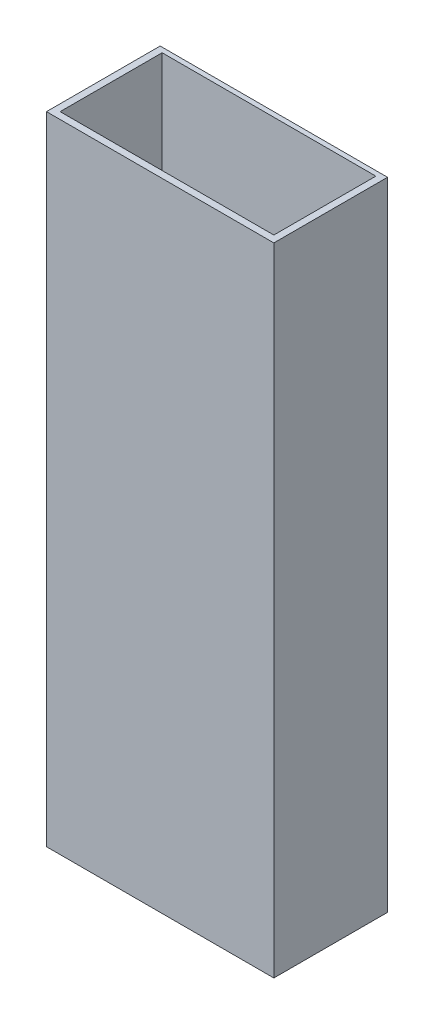
ISO-10303-21;
HEADER;
FILE_DESCRIPTION(('STEP AP214'),'2;1');
FILE_NAME('part.step','',(''),(''),'','','');
FILE_SCHEMA(('AUTOMOTIVE_DESIGN { 1 0 10303 214 1 1 1 1 }'));
ENDSEC;
DATA;
#1=APPLICATION_CONTEXT('core data for automotive mechanical design processes');
#2=APPLICATION_PROTOCOL_DEFINITION('international standard','automotive_design',2000,#1);
#3=PRODUCT_CONTEXT('',#1,'mechanical');
#4=PRODUCT('Part','Part','',(#3));
#5=PRODUCT_RELATED_PRODUCT_CATEGORY('part','',(#4));
#6=PRODUCT_DEFINITION_FORMATION('','',#4);
#7=PRODUCT_DEFINITION_CONTEXT('part definition',#1,'design');
#8=PRODUCT_DEFINITION('design','',#6,#7);
#9=PRODUCT_DEFINITION_SHAPE('','',#8);
#10=(LENGTH_UNIT() NAMED_UNIT(*) SI_UNIT(.MILLI.,.METRE.));
#11=(NAMED_UNIT(*) PLANE_ANGLE_UNIT() SI_UNIT($,.RADIAN.));
#12=(NAMED_UNIT(*) SI_UNIT($,.STERADIAN.) SOLID_ANGLE_UNIT());
#13=UNCERTAINTY_MEASURE_WITH_UNIT(LENGTH_MEASURE(1.E-05),#10,'distance_accuracy_value','');
#14=(GEOMETRIC_REPRESENTATION_CONTEXT(3) GLOBAL_UNCERTAINTY_ASSIGNED_CONTEXT((#13)) GLOBAL_UNIT_ASSIGNED_CONTEXT((#10,
#11,#12)) REPRESENTATION_CONTEXT('',''));
#15=CARTESIAN_POINT('',(0.,0.,0.));
#16=DIRECTION('',(0.,0.,1.));
#17=DIRECTION('',(1.,0.,0.));
#18=AXIS2_PLACEMENT_3D('',#15,#16,#17);
#19=CARTESIAN_POINT('',(0.,140.,0.));
#20=DIRECTION('',(0.,-1.,0.));
#21=DIRECTION('',(0.,0.,-1.));
#22=AXIS2_PLACEMENT_3D('',#19,#20,#21);
#23=PLANE('',#22);
#24=DIRECTION('',(0.,0.,1.));
#25=VECTOR('',#24,1.);
#26=CARTESIAN_POINT('',(0.,140.,0.));
#27=LINE('',#26,#25);
#28=CARTESIAN_POINT('',(0.,140.,-25.));
#29=VERTEX_POINT('',#28);
#30=CARTESIAN_POINT('',(0.,140.,0.));
#31=VERTEX_POINT('',#30);
#32=EDGE_CURVE('E134',#29,#31,#27,.T.);
#33=ORIENTED_EDGE('',*,*,#32,.T.);
#34=DIRECTION('',(1.,0.,0.));
#35=VECTOR('',#34,1.);
#36=CARTESIAN_POINT('',(0.,140.,0.));
#37=LINE('',#36,#35);
#38=CARTESIAN_POINT('',(50.,140.,0.));
#39=VERTEX_POINT('',#38);
#40=EDGE_CURVE('E137',#31,#39,#37,.T.);
#41=ORIENTED_EDGE('',*,*,#40,.T.);
#42=DIRECTION('',(0.,0.,-1.));
#43=VECTOR('',#42,1.);
#44=CARTESIAN_POINT('',(50.,140.,0.));
#45=LINE('',#44,#43);
#46=CARTESIAN_POINT('',(50.,140.,-25.));
#47=VERTEX_POINT('',#46);
#48=EDGE_CURVE('E140',#39,#47,#45,.T.);
#49=ORIENTED_EDGE('',*,*,#48,.T.);
#50=DIRECTION('',(-1.,0.,0.));
#51=VECTOR('',#50,1.);
#52=CARTESIAN_POINT('',(0.,140.,-25.));
#53=LINE('',#52,#51);
#54=EDGE_CURVE('E142',#47,#29,#53,.T.);
#55=ORIENTED_EDGE('',*,*,#54,.T.);
#56=EDGE_LOOP('',(#33,#41,#49,#55));
#57=FACE_BOUND('',#56,.T.);
#58=DIRECTION('',(0.,0.,1.));
#59=VECTOR('',#58,1.);
#60=CARTESIAN_POINT('',(1.49999999999999,140.,-1.49999999999999));
#61=LINE('',#60,#59);
#62=CARTESIAN_POINT('',(1.49999999999999,140.,-23.9343870252012));
#63=VERTEX_POINT('',#62);
#64=CARTESIAN_POINT('',(1.49999999999999,140.,-1.49999999999999));
#65=VERTEX_POINT('',#64);
#66=EDGE_CURVE('E98',#63,#65,#61,.T.);
#67=ORIENTED_EDGE('',*,*,#66,.F.);
#68=DIRECTION('',(-1.,0.,0.));
#69=VECTOR('',#68,1.);
#70=CARTESIAN_POINT('',(48.5,140.,-23.9343870252012));
#71=LINE('',#70,#69);
#72=CARTESIAN_POINT('',(48.5,140.,-23.9343870252012));
#73=VERTEX_POINT('',#72);
#74=EDGE_CURVE('E120',#73,#63,#71,.T.);
#75=ORIENTED_EDGE('',*,*,#74,.F.);
#76=DIRECTION('',(0.,0.,-1.));
#77=VECTOR('',#76,1.);
#78=CARTESIAN_POINT('',(48.5,140.,-1.49999999999999));
#79=LINE('',#78,#77);
#80=CARTESIAN_POINT('',(48.5,140.,-1.49999999999999));
#81=VERTEX_POINT('',#80);
#82=EDGE_CURVE('E118',#81,#73,#79,.T.);
#83=ORIENTED_EDGE('',*,*,#82,.F.);
#84=DIRECTION('',(1.,0.,0.));
#85=VECTOR('',#84,1.);
#86=CARTESIAN_POINT('',(48.5,140.,-1.49999999999999));
#87=LINE('',#86,#85);
#88=EDGE_CURVE('E106',#65,#81,#87,.T.);
#89=ORIENTED_EDGE('',*,*,#88,.F.);
#90=EDGE_LOOP('',(#67,#75,#83,#89));
#91=FACE_BOUND('',#90,.T.);
#92=ADVANCED_FACE('F33',(#57,#91),#23,.F.);
#93=CARTESIAN_POINT('',(0.,0.,0.));
#94=DIRECTION('',(0.,-1.,0.));
#95=DIRECTION('',(0.,0.,-1.));
#96=AXIS2_PLACEMENT_3D('',#93,#94,#95);
#97=PLANE('',#96);
#98=DIRECTION('',(0.,0.,1.));
#99=VECTOR('',#98,1.);
#100=CARTESIAN_POINT('',(0.,0.,0.));
#101=LINE('',#100,#99);
#102=CARTESIAN_POINT('',(0.,0.,-25.));
#103=VERTEX_POINT('',#102);
#104=CARTESIAN_POINT('',(0.,0.,0.));
#105=VERTEX_POINT('',#104);
#106=EDGE_CURVE('E114',#103,#105,#101,.T.);
#107=ORIENTED_EDGE('',*,*,#106,.F.);
#108=DIRECTION('',(-1.,0.,0.));
#109=VECTOR('',#108,1.);
#110=CARTESIAN_POINT('',(0.,0.,-25.));
#111=LINE('',#110,#109);
#112=CARTESIAN_POINT('',(50.,0.,-25.));
#113=VERTEX_POINT('',#112);
#114=EDGE_CURVE('E138',#113,#103,#111,.T.);
#115=ORIENTED_EDGE('',*,*,#114,.F.);
#116=DIRECTION('',(0.,0.,-1.));
#117=VECTOR('',#116,1.);
#118=CARTESIAN_POINT('',(50.,0.,0.));
#119=LINE('',#118,#117);
#120=CARTESIAN_POINT('',(50.,0.,0.));
#121=VERTEX_POINT('',#120);
#122=EDGE_CURVE('E149',#121,#113,#119,.T.);
#123=ORIENTED_EDGE('',*,*,#122,.F.);
#124=DIRECTION('',(1.,0.,0.));
#125=VECTOR('',#124,1.);
#126=CARTESIAN_POINT('',(0.,0.,0.));
#127=LINE('',#126,#125);
#128=EDGE_CURVE('E147',#105,#121,#127,.T.);
#129=ORIENTED_EDGE('',*,*,#128,.F.);
#130=EDGE_LOOP('',(#107,#115,#123,#129));
#131=FACE_BOUND('',#130,.T.);
#132=DIRECTION('',(-1.,0.,0.));
#133=VECTOR('',#132,1.);
#134=CARTESIAN_POINT('',(48.5,0.,-23.9343870252012));
#135=LINE('',#134,#133);
#136=CARTESIAN_POINT('',(48.5,0.,-23.9343870252012));
#137=VERTEX_POINT('',#136);
#138=CARTESIAN_POINT('',(1.49999999999999,0.,-23.9343870252012));
#139=VERTEX_POINT('',#138);
#140=EDGE_CURVE('E107',#137,#139,#135,.T.);
#141=ORIENTED_EDGE('',*,*,#140,.T.);
#142=DIRECTION('',(0.,0.,1.));
#143=VECTOR('',#142,1.);
#144=CARTESIAN_POINT('',(1.49999999999999,0.,-1.49999999999999));
#145=LINE('',#144,#143);
#146=CARTESIAN_POINT('',(1.49999999999999,0.,-1.49999999999999));
#147=VERTEX_POINT('',#146);
#148=EDGE_CURVE('E56',#139,#147,#145,.T.);
#149=ORIENTED_EDGE('',*,*,#148,.T.);
#150=DIRECTION('',(1.,0.,0.));
#151=VECTOR('',#150,1.);
#152=CARTESIAN_POINT('',(48.5,0.,-1.49999999999999));
#153=LINE('',#152,#151);
#154=CARTESIAN_POINT('',(48.5,0.,-1.49999999999999));
#155=VERTEX_POINT('',#154);
#156=EDGE_CURVE('E113',#147,#155,#153,.T.);
#157=ORIENTED_EDGE('',*,*,#156,.T.);
#158=DIRECTION('',(0.,0.,-1.));
#159=VECTOR('',#158,1.);
#160=CARTESIAN_POINT('',(48.5,0.,-1.49999999999999));
#161=LINE('',#160,#159);
#162=EDGE_CURVE('E126',#155,#137,#161,.T.);
#163=ORIENTED_EDGE('',*,*,#162,.T.);
#164=EDGE_LOOP('',(#141,#149,#157,#163));
#165=FACE_BOUND('',#164,.T.);
#166=ADVANCED_FACE('F167',(#131,#165),#97,.T.);
#167=CARTESIAN_POINT('',(0.,140.,0.));
#168=DIRECTION('',(1.,0.,0.));
#169=DIRECTION('',(0.,0.,-1.));
#170=AXIS2_PLACEMENT_3D('',#167,#168,#169);
#171=PLANE('',#170);
#172=ORIENTED_EDGE('',*,*,#106,.T.);
#173=DIRECTION('',(0.,-1.,0.));
#174=VECTOR('',#173,1.);
#175=CARTESIAN_POINT('',(0.,140.,0.));
#176=LINE('',#175,#174);
#177=EDGE_CURVE('E11',#31,#105,#176,.T.);
#178=ORIENTED_EDGE('',*,*,#177,.F.);
#179=ORIENTED_EDGE('',*,*,#32,.F.);
#180=DIRECTION('',(0.,-1.,0.));
#181=VECTOR('',#180,1.);
#182=CARTESIAN_POINT('',(0.,140.,-25.));
#183=LINE('',#182,#181);
#184=EDGE_CURVE('E144',#29,#103,#183,.T.);
#185=ORIENTED_EDGE('',*,*,#184,.T.);
#186=EDGE_LOOP('',(#172,#178,#179,#185));
#187=FACE_BOUND('',#186,.T.);
#188=ADVANCED_FACE('F35',(#187),#171,.F.);
#189=CARTESIAN_POINT('',(0.,140.,0.));
#190=DIRECTION('',(0.,0.,-1.));
#191=DIRECTION('',(-1.,0.,0.));
#192=AXIS2_PLACEMENT_3D('',#189,#190,#191);
#193=PLANE('',#192);
#194=ORIENTED_EDGE('',*,*,#128,.T.);
#195=DIRECTION('',(0.,-1.,0.));
#196=VECTOR('',#195,1.);
#197=CARTESIAN_POINT('',(50.,140.,0.));
#198=LINE('',#197,#196);
#199=EDGE_CURVE('E41',#39,#121,#198,.T.);
#200=ORIENTED_EDGE('',*,*,#199,.F.);
#201=ORIENTED_EDGE('',*,*,#40,.F.);
#202=ORIENTED_EDGE('',*,*,#177,.T.);
#203=EDGE_LOOP('',(#194,#200,#201,#202));
#204=FACE_BOUND('',#203,.T.);
#205=ADVANCED_FACE('F177',(#204),#193,.F.);
#206=CARTESIAN_POINT('',(50.,140.,0.));
#207=DIRECTION('',(-1.,0.,0.));
#208=DIRECTION('',(0.,0.,1.));
#209=AXIS2_PLACEMENT_3D('',#206,#207,#208);
#210=PLANE('',#209);
#211=ORIENTED_EDGE('',*,*,#122,.T.);
#212=DIRECTION('',(0.,-1.,0.));
#213=VECTOR('',#212,1.);
#214=CARTESIAN_POINT('',(50.,140.,-25.));
#215=LINE('',#214,#213);
#216=EDGE_CURVE('E154',#47,#113,#215,.T.);
#217=ORIENTED_EDGE('',*,*,#216,.F.);
#218=ORIENTED_EDGE('',*,*,#48,.F.);
#219=ORIENTED_EDGE('',*,*,#199,.T.);
#220=EDGE_LOOP('',(#211,#217,#218,#219));
#221=FACE_BOUND('',#220,.T.);
#222=ADVANCED_FACE('F161',(#221),#210,.F.);
#223=CARTESIAN_POINT('',(0.,140.,-25.));
#224=DIRECTION('',(0.,0.,1.));
#225=DIRECTION('',(1.,0.,0.));
#226=AXIS2_PLACEMENT_3D('',#223,#224,#225);
#227=PLANE('',#226);
#228=ORIENTED_EDGE('',*,*,#114,.T.);
#229=ORIENTED_EDGE('',*,*,#184,.F.);
#230=ORIENTED_EDGE('',*,*,#54,.F.);
#231=ORIENTED_EDGE('',*,*,#216,.T.);
#232=EDGE_LOOP('',(#228,#229,#230,#231));
#233=FACE_BOUND('',#232,.T.);
#234=ADVANCED_FACE('F171',(#233),#227,.F.);
#235=CARTESIAN_POINT('',(1.49999999999999,140.,-1.49999999999999));
#236=DIRECTION('',(1.,0.,0.));
#237=DIRECTION('',(0.,0.,-1.));
#238=AXIS2_PLACEMENT_3D('',#235,#236,#237);
#239=PLANE('',#238);
#240=ORIENTED_EDGE('',*,*,#148,.F.);
#241=DIRECTION('',(0.,-1.,0.));
#242=VECTOR('',#241,1.);
#243=CARTESIAN_POINT('',(1.49999999999999,140.,-23.9343870252012));
#244=LINE('',#243,#242);
#245=EDGE_CURVE('E102',#63,#139,#244,.T.);
#246=ORIENTED_EDGE('',*,*,#245,.F.);
#247=ORIENTED_EDGE('',*,*,#66,.T.);
#248=DIRECTION('',(0.,-1.,0.));
#249=VECTOR('',#248,1.);
#250=CARTESIAN_POINT('',(1.49999999999999,140.,-1.49999999999999));
#251=LINE('',#250,#249);
#252=EDGE_CURVE('E101',#65,#147,#251,.T.);
#253=ORIENTED_EDGE('',*,*,#252,.T.);
#254=EDGE_LOOP('',(#240,#246,#247,#253));
#255=FACE_BOUND('',#254,.T.);
#256=ADVANCED_FACE('F100',(#255),#239,.T.);
#257=CARTESIAN_POINT('',(48.5,140.,-1.49999999999999));
#258=DIRECTION('',(0.,0.,-1.));
#259=DIRECTION('',(-1.,0.,0.));
#260=AXIS2_PLACEMENT_3D('',#257,#258,#259);
#261=PLANE('',#260);
#262=ORIENTED_EDGE('',*,*,#156,.F.);
#263=ORIENTED_EDGE('',*,*,#252,.F.);
#264=ORIENTED_EDGE('',*,*,#88,.T.);
#265=DIRECTION('',(0.,-1.,0.));
#266=VECTOR('',#265,1.);
#267=CARTESIAN_POINT('',(48.5,140.,-1.49999999999999));
#268=LINE('',#267,#266);
#269=EDGE_CURVE('E115',#81,#155,#268,.T.);
#270=ORIENTED_EDGE('',*,*,#269,.T.);
#271=EDGE_LOOP('',(#262,#263,#264,#270));
#272=FACE_BOUND('',#271,.T.);
#273=ADVANCED_FACE('F110',(#272),#261,.T.);
#274=CARTESIAN_POINT('',(48.5,140.,-1.49999999999999));
#275=DIRECTION('',(-1.,0.,0.));
#276=DIRECTION('',(0.,0.,1.));
#277=AXIS2_PLACEMENT_3D('',#274,#275,#276);
#278=PLANE('',#277);
#279=ORIENTED_EDGE('',*,*,#162,.F.);
#280=ORIENTED_EDGE('',*,*,#269,.F.);
#281=ORIENTED_EDGE('',*,*,#82,.T.);
#282=DIRECTION('',(0.,-1.,0.));
#283=VECTOR('',#282,1.);
#284=CARTESIAN_POINT('',(48.5,140.,-23.9343870252012));
#285=LINE('',#284,#283);
#286=EDGE_CURVE('E48',#73,#137,#285,.T.);
#287=ORIENTED_EDGE('',*,*,#286,.T.);
#288=EDGE_LOOP('',(#279,#280,#281,#287));
#289=FACE_BOUND('',#288,.T.);
#290=ADVANCED_FACE('F200',(#289),#278,.T.);
#291=CARTESIAN_POINT('',(48.5,140.,-23.9343870252012));
#292=DIRECTION('',(0.,0.,1.));
#293=DIRECTION('',(1.,0.,0.));
#294=AXIS2_PLACEMENT_3D('',#291,#292,#293);
#295=PLANE('',#294);
#296=ORIENTED_EDGE('',*,*,#140,.F.);
#297=ORIENTED_EDGE('',*,*,#286,.F.);
#298=ORIENTED_EDGE('',*,*,#74,.T.);
#299=ORIENTED_EDGE('',*,*,#245,.T.);
#300=EDGE_LOOP('',(#296,#297,#298,#299));
#301=FACE_BOUND('',#300,.T.);
#302=ADVANCED_FACE('F204',(#301),#295,.T.);
#303=CLOSED_SHELL('',(#92,#166,#188,#205,#222,#234,#256,#273,#290,#302));
#304=MANIFOLD_SOLID_BREP('B2',#303);
#305=ADVANCED_BREP_SHAPE_REPRESENTATION('',(#18,#304),#14);
#306=SHAPE_DEFINITION_REPRESENTATION(#9,#305);
ENDSEC;
END-ISO-10303-21;
